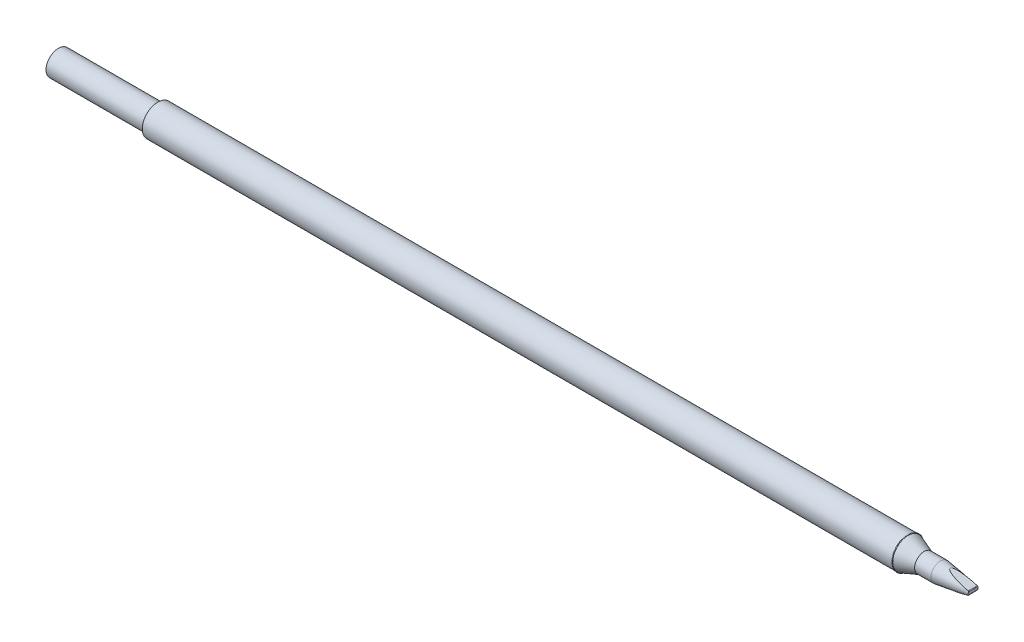
ISO-10303-21;
HEADER;
FILE_DESCRIPTION(('STEP AP214'),'2;1');
FILE_NAME('part.step','',(''),(''),'','','');
FILE_SCHEMA(('AUTOMOTIVE_DESIGN { 1 0 10303 214 1 1 1 1 }'));
ENDSEC;
DATA;
#1=APPLICATION_CONTEXT('core data for automotive mechanical design processes');
#2=APPLICATION_PROTOCOL_DEFINITION('international standard','automotive_design',2000,#1);
#3=PRODUCT_CONTEXT('',#1,'mechanical');
#4=PRODUCT('Part','Part','',(#3));
#5=PRODUCT_RELATED_PRODUCT_CATEGORY('part','',(#4));
#6=PRODUCT_DEFINITION_FORMATION('','',#4);
#7=PRODUCT_DEFINITION_CONTEXT('part definition',#1,'design');
#8=PRODUCT_DEFINITION('design','',#6,#7);
#9=PRODUCT_DEFINITION_SHAPE('','',#8);
#10=(LENGTH_UNIT() NAMED_UNIT(*) SI_UNIT(.MILLI.,.METRE.));
#11=(NAMED_UNIT(*) PLANE_ANGLE_UNIT() SI_UNIT($,.RADIAN.));
#12=(NAMED_UNIT(*) SI_UNIT($,.STERADIAN.) SOLID_ANGLE_UNIT());
#13=UNCERTAINTY_MEASURE_WITH_UNIT(LENGTH_MEASURE(1.E-05),#10,'distance_accuracy_value','');
#14=(GEOMETRIC_REPRESENTATION_CONTEXT(3) GLOBAL_UNCERTAINTY_ASSIGNED_CONTEXT((#13)) GLOBAL_UNIT_ASSIGNED_CONTEXT((#10,
#11,#12)) REPRESENTATION_CONTEXT('',''));
#15=CARTESIAN_POINT('',(0.,0.,0.));
#16=DIRECTION('',(0.,0.,1.));
#17=DIRECTION('',(1.,0.,0.));
#18=AXIS2_PLACEMENT_3D('',#15,#16,#17);
#19=CARTESIAN_POINT('',(0.,0.,0.));
#20=DIRECTION('',(-1.,0.,0.));
#21=DIRECTION('',(0.,0.,1.));
#22=AXIS2_PLACEMENT_3D('',#19,#20,#21);
#23=CYLINDRICAL_SURFACE('',#22,2.365);
#24=CARTESIAN_POINT('',(0.200000000000017,0.,0.));
#25=DIRECTION('',(1.,0.,0.));
#26=DIRECTION('',(0.,0.,-1.));
#27=AXIS2_PLACEMENT_3D('',#24,#25,#26);
#28=CIRCLE('',#27,2.365);
#29=CARTESIAN_POINT('',(0.200000000000017,0.,-2.365));
#30=VERTEX_POINT('',#29);
#31=EDGE_CURVE('E193',#30,#30,#28,.T.);
#32=ORIENTED_EDGE('',*,*,#31,.T.);
#33=EDGE_LOOP('',(#32));
#34=FACE_BOUND('',#33,.T.);
#35=CARTESIAN_POINT('',(114.95,0.,0.));
#36=DIRECTION('',(1.,0.,0.));
#37=DIRECTION('',(0.,0.,-1.));
#38=AXIS2_PLACEMENT_3D('',#35,#36,#37);
#39=CIRCLE('',#38,2.365);
#40=CARTESIAN_POINT('',(114.95,0.,-2.365));
#41=VERTEX_POINT('',#40);
#42=EDGE_CURVE('E192',#41,#41,#39,.T.);
#43=ORIENTED_EDGE('',*,*,#42,.F.);
#44=EDGE_LOOP('',(#43));
#45=FACE_BOUND('',#44,.T.);
#46=ADVANCED_FACE('F36',(#34,#45),#23,.T.);
#47=CARTESIAN_POINT('',(-15.,0.,0.));
#48=DIRECTION('',(1.,0.,0.));
#49=DIRECTION('',(0.,0.,-1.));
#50=AXIS2_PLACEMENT_3D('',#47,#48,#49);
#51=PLANE('',#50);
#52=CARTESIAN_POINT('',(-15.,0.,0.));
#53=DIRECTION('',(1.,0.,0.));
#54=DIRECTION('',(0.,0.,-1.));
#55=AXIS2_PLACEMENT_3D('',#52,#53,#54);
#56=CIRCLE('',#55,0.0499999999999983);
#57=CARTESIAN_POINT('',(-15.,0.,-0.0499999999999983));
#58=VERTEX_POINT('',#57);
#59=EDGE_CURVE('E363',#58,#58,#56,.F.);
#60=ORIENTED_EDGE('',*,*,#59,.T.);
#61=EDGE_LOOP('',(#60));
#62=FACE_BOUND('',#61,.T.);
#63=ADVANCED_FACE('F146',(#62),#51,.F.);
#64=CARTESIAN_POINT('',(0.,0.,0.));
#65=DIRECTION('',(-1.,0.,0.));
#66=DIRECTION('',(0.,0.,1.));
#67=AXIS2_PLACEMENT_3D('',#64,#65,#66);
#68=CYLINDRICAL_SURFACE('',#67,0.499999999999998);
#69=CARTESIAN_POINT('',(-14.55,0.,0.));
#70=DIRECTION('',(1.,0.,0.));
#71=DIRECTION('',(0.,0.,-1.));
#72=AXIS2_PLACEMENT_3D('',#69,#70,#71);
#73=CIRCLE('',#72,0.499999999999998);
#74=CARTESIAN_POINT('',(-14.55,0.,-0.499999999999998));
#75=VERTEX_POINT('',#74);
#76=EDGE_CURVE('E366',#75,#75,#73,.T.);
#77=ORIENTED_EDGE('',*,*,#76,.T.);
#78=EDGE_LOOP('',(#77));
#79=FACE_BOUND('',#78,.T.);
#80=CARTESIAN_POINT('',(0.,0.,0.));
#81=DIRECTION('',(-1.,0.,0.));
#82=DIRECTION('',(0.,0.,1.));
#83=AXIS2_PLACEMENT_3D('',#80,#81,#82);
#84=CIRCLE('',#83,0.499999999999999);
#85=CARTESIAN_POINT('',(0.,0.,0.499999999999999));
#86=VERTEX_POINT('',#85);
#87=EDGE_CURVE('E360',#86,#86,#84,.T.);
#88=ORIENTED_EDGE('',*,*,#87,.T.);
#89=EDGE_LOOP('',(#88));
#90=FACE_BOUND('',#89,.T.);
#91=ADVANCED_FACE('F149',(#79,#90),#68,.T.);
#92=CARTESIAN_POINT('',(0.,0.499999999999999,0.));
#93=DIRECTION('',(1.,0.,0.));
#94=DIRECTION('',(0.,0.,-1.));
#95=AXIS2_PLACEMENT_3D('',#92,#93,#94);
#96=PLANE('',#95);
#97=ORIENTED_EDGE('',*,*,#87,.F.);
#98=EDGE_LOOP('',(#97));
#99=FACE_BOUND('',#98,.T.);
#100=CARTESIAN_POINT('',(0.,0.,0.));
#101=DIRECTION('',(-1.,0.,0.));
#102=DIRECTION('',(0.,0.,1.));
#103=AXIS2_PLACEMENT_3D('',#100,#101,#102);
#104=CIRCLE('',#103,1.49);
#105=CARTESIAN_POINT('',(0.,0.,1.49));
#106=VERTEX_POINT('',#105);
#107=EDGE_CURVE('E357',#106,#106,#104,.T.);
#108=ORIENTED_EDGE('',*,*,#107,.T.);
#109=EDGE_LOOP('',(#108));
#110=FACE_BOUND('',#109,.T.);
#111=ADVANCED_FACE('F153',(#99,#110),#96,.F.);
#112=CARTESIAN_POINT('',(0.,0.,0.));
#113=DIRECTION('',(-1.,0.,0.));
#114=DIRECTION('',(0.,0.,1.));
#115=AXIS2_PLACEMENT_3D('',#112,#113,#114);
#116=CYLINDRICAL_SURFACE('',#115,1.49);
#117=ORIENTED_EDGE('',*,*,#107,.F.);
#118=EDGE_LOOP('',(#117));
#119=FACE_BOUND('',#118,.T.);
#120=CARTESIAN_POINT('',(-15.,0.,0.));
#121=DIRECTION('',(-1.,0.,0.));
#122=DIRECTION('',(0.,0.,1.));
#123=AXIS2_PLACEMENT_3D('',#120,#121,#122);
#124=CIRCLE('',#123,1.49);
#125=CARTESIAN_POINT('',(-15.,0.,1.49));
#126=VERTEX_POINT('',#125);
#127=EDGE_CURVE('E354',#126,#126,#124,.T.);
#128=ORIENTED_EDGE('',*,*,#127,.T.);
#129=EDGE_LOOP('',(#128));
#130=FACE_BOUND('',#129,.T.);
#131=ADVANCED_FACE('F157',(#119,#130),#116,.F.);
#132=CARTESIAN_POINT('',(-15.,1.49,0.));
#133=DIRECTION('',(1.,0.,0.));
#134=DIRECTION('',(0.,0.,-1.));
#135=AXIS2_PLACEMENT_3D('',#132,#133,#134);
#136=PLANE('',#135);
#137=ORIENTED_EDGE('',*,*,#127,.F.);
#138=EDGE_LOOP('',(#137));
#139=FACE_BOUND('',#138,.T.);
#140=CARTESIAN_POINT('',(-15.,0.,0.));
#141=DIRECTION('',(-1.,0.,0.));
#142=DIRECTION('',(0.,0.,1.));
#143=AXIS2_PLACEMENT_3D('',#140,#141,#142);
#144=CIRCLE('',#143,1.9);
#145=CARTESIAN_POINT('',(-15.,0.,1.9));
#146=VERTEX_POINT('',#145);
#147=EDGE_CURVE('E351',#146,#146,#144,.T.);
#148=ORIENTED_EDGE('',*,*,#147,.T.);
#149=EDGE_LOOP('',(#148));
#150=FACE_BOUND('',#149,.T.);
#151=ADVANCED_FACE('F161',(#139,#150),#136,.F.);
#152=CARTESIAN_POINT('',(0.,0.,0.));
#153=DIRECTION('',(-1.,0.,0.));
#154=DIRECTION('',(0.,0.,1.));
#155=AXIS2_PLACEMENT_3D('',#152,#153,#154);
#156=CYLINDRICAL_SURFACE('',#155,1.9);
#157=ORIENTED_EDGE('',*,*,#147,.F.);
#158=EDGE_LOOP('',(#157));
#159=FACE_BOUND('',#158,.T.);
#160=CARTESIAN_POINT('',(0.,0.,0.));
#161=DIRECTION('',(-1.,0.,0.));
#162=DIRECTION('',(0.,0.,1.));
#163=AXIS2_PLACEMENT_3D('',#160,#161,#162);
#164=CIRCLE('',#163,1.9);
#165=CARTESIAN_POINT('',(0.,0.,1.9));
#166=VERTEX_POINT('',#165);
#167=EDGE_CURVE('E348',#166,#166,#164,.T.);
#168=ORIENTED_EDGE('',*,*,#167,.T.);
#169=EDGE_LOOP('',(#168));
#170=FACE_BOUND('',#169,.T.);
#171=ADVANCED_FACE('F165',(#159,#170),#156,.T.);
#172=CARTESIAN_POINT('',(0.,1.9,0.));
#173=DIRECTION('',(1.,0.,0.));
#174=DIRECTION('',(0.,0.,-1.));
#175=AXIS2_PLACEMENT_3D('',#172,#173,#174);
#176=PLANE('',#175);
#177=CARTESIAN_POINT('',(0.,0.,0.));
#178=DIRECTION('',(1.,0.,0.));
#179=DIRECTION('',(0.,0.,-1.));
#180=AXIS2_PLACEMENT_3D('',#177,#178,#179);
#181=CIRCLE('',#180,2.01858983848621);
#182=CARTESIAN_POINT('',(0.,0.,-2.01858983848621));
#183=VERTEX_POINT('',#182);
#184=EDGE_CURVE('E199',#183,#183,#181,.F.);
#185=ORIENTED_EDGE('',*,*,#184,.T.);
#186=EDGE_LOOP('',(#185));
#187=FACE_BOUND('',#186,.T.);
#188=ORIENTED_EDGE('',*,*,#167,.F.);
#189=EDGE_LOOP('',(#188));
#190=FACE_BOUND('',#189,.T.);
#191=ADVANCED_FACE('F142',(#187,#190),#176,.F.);
#192=CARTESIAN_POINT('',(-14.55,0.,0.));
#193=DIRECTION('',(1.,0.,0.));
#194=DIRECTION('',(0.,0.,-1.));
#195=AXIS2_PLACEMENT_3D('',#192,#193,#194);
#196=DEGENERATE_TOROIDAL_SURFACE('',#195,0.0499999999999983,0.45,.T.);
#197=ORIENTED_EDGE('',*,*,#76,.F.);
#198=EDGE_LOOP('',(#197));
#199=FACE_BOUND('',#198,.T.);
#200=ORIENTED_EDGE('',*,*,#59,.F.);
#201=EDGE_LOOP('',(#200));
#202=FACE_BOUND('',#201,.T.);
#203=ADVANCED_FACE('F138',(#199,#202),#196,.T.);
#204=CARTESIAN_POINT('',(0.,0.,0.));
#205=DIRECTION('',(1.,0.,0.));
#206=DIRECTION('',(0.,0.,-1.));
#207=AXIS2_PLACEMENT_3D('',#204,#205,#206);
#208=CONICAL_SURFACE('',#207,2.01858983848621,1.04719755119658);
#209=ORIENTED_EDGE('',*,*,#31,.F.);
#210=EDGE_LOOP('',(#209));
#211=FACE_BOUND('',#210,.T.);
#212=ORIENTED_EDGE('',*,*,#184,.F.);
#213=EDGE_LOOP('',(#212));
#214=FACE_BOUND('',#213,.T.);
#215=ADVANCED_FACE('F134',(#211,#214),#208,.T.);
#216=CARTESIAN_POINT('',(115.,0.,0.));
#217=DIRECTION('',(-1.,0.,0.));
#218=DIRECTION('',(0.,0.,1.));
#219=AXIS2_PLACEMENT_3D('',#216,#217,#218);
#220=TOROIDAL_SURFACE('',#219,2.365,0.0499999999999968);
#221=CARTESIAN_POINT('',(115.046953925083,0.,0.));
#222=DIRECTION('',(-1.,0.,0.));
#223=DIRECTION('',(0.,0.,1.));
#224=AXIS2_PLACEMENT_3D('',#221,#222,#223);
#225=CIRCLE('',#224,2.34781486341955);
#226=CARTESIAN_POINT('',(115.046953925083,0.,2.34781486341955));
#227=VERTEX_POINT('',#226);
#228=EDGE_CURVE('E190',#227,#227,#225,.T.);
#229=ORIENTED_EDGE('',*,*,#228,.T.);
#230=EDGE_LOOP('',(#229));
#231=FACE_BOUND('',#230,.T.);
#232=ORIENTED_EDGE('',*,*,#42,.T.);
#233=EDGE_LOOP('',(#232));
#234=FACE_BOUND('',#233,.T.);
#235=ADVANCED_FACE('F117',(#231,#234),#220,.T.);
#236=CARTESIAN_POINT('',(125.,0.75,0.));
#237=DIRECTION('',(-1.,0.,0.));
#238=DIRECTION('',(0.,0.,1.));
#239=AXIS2_PLACEMENT_3D('',#236,#237,#238);
#240=PLANE('',#239);
#241=CARTESIAN_POINT('',(125.,0.,0.));
#242=DIRECTION('',(-1.,0.,0.));
#243=DIRECTION('',(0.,0.,1.));
#244=AXIS2_PLACEMENT_3D('',#241,#242,#243);
#245=CIRCLE('',#244,0.75);
#246=CARTESIAN_POINT('',(125.,-0.198787657436542,0.72317595870638));
#247=VERTEX_POINT('',#246);
#248=CARTESIAN_POINT('',(125.,0.198787657436542,0.72317595870638));
#249=VERTEX_POINT('',#248);
#250=EDGE_CURVE('E79',#247,#249,#245,.T.);
#251=ORIENTED_EDGE('',*,*,#250,.F.);
#252=DIRECTION('',(0.,0.,-1.));
#253=VECTOR('',#252,1.);
#254=CARTESIAN_POINT('',(125.,-0.198787657436542,0.));
#255=LINE('',#254,#253);
#256=CARTESIAN_POINT('',(125.,-0.198787657436542,-0.72317595870638));
#257=VERTEX_POINT('',#256);
#258=EDGE_CURVE('E92',#247,#257,#255,.T.);
#259=ORIENTED_EDGE('',*,*,#258,.T.);
#260=CARTESIAN_POINT('',(125.,0.198787657436542,-0.72317595870638));
#261=VERTEX_POINT('',#260);
#262=EDGE_CURVE('E95',#261,#257,#245,.T.);
#263=ORIENTED_EDGE('',*,*,#262,.F.);
#264=DIRECTION('',(0.,0.,1.));
#265=VECTOR('',#264,1.);
#266=CARTESIAN_POINT('',(125.,0.198787657436542,0.));
#267=LINE('',#266,#265);
#268=EDGE_CURVE('E94',#261,#249,#267,.T.);
#269=ORIENTED_EDGE('',*,*,#268,.T.);
#270=EDGE_LOOP('',(#251,#259,#263,#269));
#271=FACE_BOUND('',#270,.T.);
#272=ADVANCED_FACE('F90',(#271),#240,.F.);
#273=CARTESIAN_POINT('',(125.,0.,0.));
#274=DIRECTION('',(-1.,0.,0.));
#275=DIRECTION('',(0.,0.,1.));
#276=AXIS2_PLACEMENT_3D('',#273,#274,#275);
#277=CONICAL_SURFACE('',#276,0.75,0.139095941482072);
#278=CARTESIAN_POINT('',(120.,0.,0.));
#279=DIRECTION('',(-1.,0.,0.));
#280=DIRECTION('',(0.,0.,1.));
#281=AXIS2_PLACEMENT_3D('',#278,#279,#280);
#282=CIRCLE('',#281,1.45);
#283=CARTESIAN_POINT('',(120.,0.,1.45));
#284=VERTEX_POINT('',#283);
#285=EDGE_CURVE('E343',#284,#284,#282,.T.);
#286=ORIENTED_EDGE('',*,*,#285,.F.);
#287=EDGE_LOOP('',(#286));
#288=FACE_BOUND('',#287,.T.);
#289=ORIENTED_EDGE('',*,*,#262,.T.);
#290=CARTESIAN_POINT('',(125.,-0.198787657436542,-0.72317595870638));
#291=CARTESIAN_POINT('',(125.000003507059,-0.204553288456461,-0.721593490091671));
#292=CARTESIAN_POINT('',(124.999501541528,-0.210317406382677,-0.720004951516099));
#293=CARTESIAN_POINT('',(124.997511568684,-0.221693849510812,-0.716873937111745));
#294=CARTESIAN_POINT('',(124.996022300598,-0.227305971065097,-0.715331522818555));
#295=CARTESIAN_POINT('',(124.992081167227,-0.238218482839555,-0.712354122134174));
#296=CARTESIAN_POINT('',(124.989628529648,-0.243518619024399,-0.710919223035155));
#297=CARTESIAN_POINT('',(124.983814287478,-0.253643789631828,-0.708234531805531));
#298=CARTESIAN_POINT('',(124.980453260358,-0.258469123241613,-0.706984622853527));
#299=CARTESIAN_POINT('',(124.973000197767,-0.267371775752997,-0.704781424492752));
#300=CARTESIAN_POINT('',(124.968929919946,-0.27146554233544,-0.703821145917506));
#301=CARTESIAN_POINT('',(124.960107365752,-0.278914808504914,-0.702231666127871));
#302=CARTESIAN_POINT('',(124.955355697587,-0.28227095979031,-0.701602171968961));
#303=CARTESIAN_POINT('',(124.946613628536,-0.287363917743545,-0.700852048190955));
#304=CARTESIAN_POINT('',(124.942742724045,-0.289295142025169,-0.700642075326405));
#305=CARTESIAN_POINT('',(124.934777984086,-0.292645407978159,-0.700457680044558));
#306=CARTESIAN_POINT('',(124.930684040212,-0.29406419798062,-0.700483373205506));
#307=CARTESIAN_POINT('',(124.926515648302,-0.29520819671692,-0.700635192854751));
#308=B_SPLINE_CURVE_WITH_KNOTS('',3,(#290,#291,#292,#293,#294,#295,#296,#297,#298,#299,#300,
#301,#302,#303,#304,#305,#306,#307),.UNSPECIFIED.,.F.,.F.,(4,2,2,2,2,2,2,2,4),(0.,
0.017916106136919,0.0358551351021427,0.0538085744948017,0.0717506274548506,0.0892167099226524,
0.106667298150119,0.119619628639407,0.132578311710199),.UNSPECIFIED.);
#309=CARTESIAN_POINT('',(124.926515648302,-0.295208196716921,-0.700635192854749));
#310=VERTEX_POINT('',#309);
#311=EDGE_CURVE('E85',#257,#310,#308,.T.);
#312=ORIENTED_EDGE('',*,*,#311,.T.);
#313=CARTESIAN_POINT('',(124.475680499777,-0.419187862561356,0.));
#314=DIRECTION('',(-0.265156483021043,0.96420539280379,0.));
#315=DIRECTION('',(-0.96420539280379,-0.265156483021043,0.));
#316=AXIS2_PLACEMENT_3D('',#313,#314,#315);
#317=ELLIPSE('',#316,3.1053539428862,0.708714953503207);
#318=CARTESIAN_POINT('',(124.926515648302,-0.295208196716921,0.700635192854749));
#319=VERTEX_POINT('',#318);
#320=EDGE_CURVE('E81',#310,#319,#317,.T.);
#321=ORIENTED_EDGE('',*,*,#320,.T.);
#322=CARTESIAN_POINT('',(124.926515648302,-0.295208196716921,0.700635192854749));
#323=CARTESIAN_POINT('',(124.931626997485,-0.293808811606557,0.700447162841778));
#324=CARTESIAN_POINT('',(124.936625566287,-0.291991480762701,0.700451516400457));
#325=CARTESIAN_POINT('',(124.946250840768,-0.287604446399892,0.700808396540888));
#326=CARTESIAN_POINT('',(124.950878577893,-0.285036929102975,0.701159918378641));
#327=CARTESIAN_POINT('',(124.959644851769,-0.279225432077028,0.702173636469321));
#328=CARTESIAN_POINT('',(124.963783616915,-0.275981770144516,0.702835686951966));
#329=CARTESIAN_POINT('',(124.971478316973,-0.268917029758876,0.704416042498972));
#330=CARTESIAN_POINT('',(124.975034058849,-0.265095760866702,0.705334432164122));
#331=CARTESIAN_POINT('',(124.981602512672,-0.256837979967937,0.707405700552667));
#332=CARTESIAN_POINT('',(124.984591612905,-0.252384506312438,0.708565714903353));
#333=CARTESIAN_POINT('',(124.989810394428,-0.243088407630517,0.711036550399219));
#334=CARTESIAN_POINT('',(124.992039488613,-0.238245485307717,0.712347487091013));
#335=CARTESIAN_POINT('',(124.995896989285,-0.227741863148172,0.715211817420555));
#336=CARTESIAN_POINT('',(124.997432332888,-0.22204981059565,0.716776018348112));
#337=CARTESIAN_POINT('',(124.999485674036,-0.210501187506141,0.719954386539173));
#338=CARTESIAN_POINT('',(125.000004092818,-0.204644686108111,0.721568532832488));
#339=CARTESIAN_POINT('',(125.,-0.198787657436544,0.72317595870638));
#340=B_SPLINE_CURVE_WITH_KNOTS('',3,(#322,#323,#324,#325,#326,#327,#328,#329,#330,#331,#332,
#333,#334,#335,#336,#337,#338,#339),.UNSPECIFIED.,.F.,.F.,(4,2,2,2,2,2,2,2,4),(0.,
0.0158806546856654,0.0317154832569595,0.0475428859728207,0.0633755184675213,0.0797672817936434,
0.0961716792244259,0.114380788868078,0.132582354246609),.UNSPECIFIED.);
#341=EDGE_CURVE('E75',#319,#247,#340,.T.);
#342=ORIENTED_EDGE('',*,*,#341,.T.);
#343=ORIENTED_EDGE('',*,*,#250,.T.);
#344=CARTESIAN_POINT('',(125.,0.198787657436542,0.72317595870638));
#345=CARTESIAN_POINT('',(125.000003507059,0.204553288456461,0.721593490091671));
#346=CARTESIAN_POINT('',(124.999501541528,0.210317406382677,0.720004951516099));
#347=CARTESIAN_POINT('',(124.997511568684,0.221693849510812,0.716873937111745));
#348=CARTESIAN_POINT('',(124.996022300598,0.227305971065097,0.715331522818555));
#349=CARTESIAN_POINT('',(124.992081167227,0.238218482839555,0.712354122134174));
#350=CARTESIAN_POINT('',(124.989628529648,0.243518619024399,0.710919223035155));
#351=CARTESIAN_POINT('',(124.983814287478,0.253643789631828,0.708234531805531));
#352=CARTESIAN_POINT('',(124.980453260358,0.258469123241613,0.706984622853527));
#353=CARTESIAN_POINT('',(124.973000197767,0.267371775752997,0.704781424492752));
#354=CARTESIAN_POINT('',(124.968929919946,0.27146554233544,0.703821145917506));
#355=CARTESIAN_POINT('',(124.960107365752,0.278914808504914,0.702231666127871));
#356=CARTESIAN_POINT('',(124.955355697587,0.28227095979031,0.701602171968961));
#357=CARTESIAN_POINT('',(124.946613628536,0.287363917743545,0.700852048190955));
#358=CARTESIAN_POINT('',(124.942742724045,0.289295142025169,0.700642075326405));
#359=CARTESIAN_POINT('',(124.934777984086,0.292645407978159,0.700457680044558));
#360=CARTESIAN_POINT('',(124.930684040212,0.29406419798062,0.700483373205506));
#361=CARTESIAN_POINT('',(124.926515648302,0.295208196716921,0.700635192854751));
#362=B_SPLINE_CURVE_WITH_KNOTS('',3,(#344,#345,#346,#347,#348,#349,#350,#351,#352,#353,#354,
#355,#356,#357,#358,#359,#360,#361),.UNSPECIFIED.,.F.,.F.,(4,2,2,2,2,2,2,2,4),(0.,
0.017916106136919,0.0358551351021426,0.0538085744948016,0.0717506274548505,0.0892167099226523,
0.106667298150119,0.119619628639407,0.132578311710199),.UNSPECIFIED.);
#363=CARTESIAN_POINT('',(124.926515648302,0.295208196716921,0.700635192854749));
#364=VERTEX_POINT('',#363);
#365=EDGE_CURVE('E56',#249,#364,#362,.T.);
#366=ORIENTED_EDGE('',*,*,#365,.T.);
#367=CARTESIAN_POINT('',(124.475680499777,0.419187862561356,0.));
#368=DIRECTION('',(-0.265156483021043,-0.96420539280379,0.));
#369=DIRECTION('',(-0.96420539280379,0.265156483021043,0.));
#370=AXIS2_PLACEMENT_3D('',#367,#368,#369);
#371=ELLIPSE('',#370,3.1053539428862,0.708714953503207);
#372=CARTESIAN_POINT('',(124.926515648302,0.295208196716921,-0.700635192854749));
#373=VERTEX_POINT('',#372);
#374=EDGE_CURVE('E196',#364,#373,#371,.T.);
#375=ORIENTED_EDGE('',*,*,#374,.T.);
#376=CARTESIAN_POINT('',(124.926515648302,0.295208196716921,-0.700635192854749));
#377=CARTESIAN_POINT('',(124.931626997485,0.293808811606557,-0.700447162841778));
#378=CARTESIAN_POINT('',(124.936625566287,0.291991480762701,-0.700451516400457));
#379=CARTESIAN_POINT('',(124.946250840768,0.287604446399892,-0.700808396540888));
#380=CARTESIAN_POINT('',(124.950878577893,0.285036929102975,-0.701159918378641));
#381=CARTESIAN_POINT('',(124.959644851769,0.279225432077028,-0.702173636469321));
#382=CARTESIAN_POINT('',(124.963783616915,0.275981770144516,-0.702835686951966));
#383=CARTESIAN_POINT('',(124.971478316973,0.268917029758876,-0.704416042498972));
#384=CARTESIAN_POINT('',(124.975034058849,0.265095760866702,-0.705334432164122));
#385=CARTESIAN_POINT('',(124.981602512672,0.256837979967938,-0.707405700552667));
#386=CARTESIAN_POINT('',(124.984591612905,0.252384506312438,-0.708565714903353));
#387=CARTESIAN_POINT('',(124.989810394428,0.243088407630517,-0.711036550399219));
#388=CARTESIAN_POINT('',(124.992039488613,0.238245485307717,-0.712347487091013));
#389=CARTESIAN_POINT('',(124.995896989285,0.227741863148172,-0.715211817420555));
#390=CARTESIAN_POINT('',(124.997432332888,0.22204981059565,-0.716776018348112));
#391=CARTESIAN_POINT('',(124.999485674036,0.210501187506141,-0.719954386539173));
#392=CARTESIAN_POINT('',(125.000004092818,0.204644686108112,-0.721568532832488));
#393=CARTESIAN_POINT('',(125.,0.198787657436545,-0.72317595870638));
#394=B_SPLINE_CURVE_WITH_KNOTS('',3,(#376,#377,#378,#379,#380,#381,#382,#383,#384,#385,#386,
#387,#388,#389,#390,#391,#392,#393),.UNSPECIFIED.,.F.,.F.,(4,2,2,2,2,2,2,2,4),(0.,
0.0158806546856654,0.0317154832569595,0.0475428859728207,0.0633755184675213,0.0797672817936435,
0.0961716792244259,0.114380788868078,0.132582354246608),.UNSPECIFIED.);
#395=EDGE_CURVE('E98',#373,#261,#394,.T.);
#396=ORIENTED_EDGE('',*,*,#395,.T.);
#397=EDGE_LOOP('',(#289,#312,#321,#342,#343,#366,#375,#396));
#398=FACE_BOUND('',#397,.T.);
#399=ADVANCED_FACE('F78',(#288,#398),#277,.T.);
#400=CARTESIAN_POINT('',(0.,0.,0.));
#401=DIRECTION('',(-1.,0.,0.));
#402=DIRECTION('',(0.,0.,1.));
#403=AXIS2_PLACEMENT_3D('',#400,#401,#402);
#404=CYLINDRICAL_SURFACE('',#403,1.45);
#405=CARTESIAN_POINT('',(117.5,0.,0.));
#406=DIRECTION('',(-1.,0.,0.));
#407=DIRECTION('',(0.,0.,1.));
#408=AXIS2_PLACEMENT_3D('',#405,#406,#407);
#409=CIRCLE('',#408,1.45);
#410=CARTESIAN_POINT('',(117.5,0.,1.45));
#411=VERTEX_POINT('',#410);
#412=EDGE_CURVE('E187',#411,#411,#409,.T.);
#413=ORIENTED_EDGE('',*,*,#412,.F.);
#414=EDGE_LOOP('',(#413));
#415=FACE_BOUND('',#414,.T.);
#416=ORIENTED_EDGE('',*,*,#285,.T.);
#417=EDGE_LOOP('',(#416));
#418=FACE_BOUND('',#417,.T.);
#419=ADVANCED_FACE('F115',(#415,#418),#404,.T.);
#420=CARTESIAN_POINT('',(117.5,0.,0.));
#421=DIRECTION('',(-1.,0.,0.));
#422=DIRECTION('',(0.,0.,1.));
#423=AXIS2_PLACEMENT_3D('',#420,#421,#422);
#424=CONICAL_SURFACE('',#423,1.45,0.350857008260393);
#425=ORIENTED_EDGE('',*,*,#412,.T.);
#426=EDGE_LOOP('',(#425));
#427=FACE_BOUND('',#426,.T.);
#428=ORIENTED_EDGE('',*,*,#228,.F.);
#429=EDGE_LOOP('',(#428));
#430=FACE_BOUND('',#429,.T.);
#431=ADVANCED_FACE('F175',(#427,#430),#424,.T.);
#432=CARTESIAN_POINT('',(120.,1.65,-5.));
#433=DIRECTION('',(-0.265156483021043,-0.96420539280379,0.));
#434=DIRECTION('',(0.96420539280379,-0.265156483021043,0.));
#435=AXIS2_PLACEMENT_3D('',#432,#433,#434);
#436=PLANE('',#435);
#437=ORIENTED_EDGE('',*,*,#374,.F.);
#438=DIRECTION('',(0.,0.,1.));
#439=VECTOR('',#438,1.);
#440=CARTESIAN_POINT('',(124.926515648302,0.295208196716921,-5.));
#441=LINE('',#440,#439);
#442=EDGE_CURVE('E11',#364,#373,#441,.F.);
#443=ORIENTED_EDGE('',*,*,#442,.T.);
#444=EDGE_LOOP('',(#437,#443));
#445=FACE_BOUND('',#444,.T.);
#446=ADVANCED_FACE('F177',(#445),#436,.F.);
#447=CARTESIAN_POINT('',(120.,-1.65,-5.));
#448=DIRECTION('',(-0.265156483021043,0.96420539280379,0.));
#449=DIRECTION('',(-0.96420539280379,-0.265156483021043,0.));
#450=AXIS2_PLACEMENT_3D('',#447,#448,#449);
#451=PLANE('',#450);
#452=ORIENTED_EDGE('',*,*,#320,.F.);
#453=DIRECTION('',(0.,0.,-1.));
#454=VECTOR('',#453,1.);
#455=CARTESIAN_POINT('',(124.926515648302,-0.295208196716921,-5.));
#456=LINE('',#455,#454);
#457=EDGE_CURVE('E45',#310,#319,#456,.F.);
#458=ORIENTED_EDGE('',*,*,#457,.T.);
#459=EDGE_LOOP('',(#452,#458));
#460=FACE_BOUND('',#459,.T.);
#461=ADVANCED_FACE('F133',(#460),#451,.F.);
#462=CARTESIAN_POINT('',(124.9,-0.198787657436542,0.));
#463=DIRECTION('',(0.,0.,-1.));
#464=DIRECTION('',(-1.,0.,0.));
#465=AXIS2_PLACEMENT_3D('',#462,#463,#464);
#466=CYLINDRICAL_SURFACE('',#465,0.1);
#467=ORIENTED_EDGE('',*,*,#341,.F.);
#468=ORIENTED_EDGE('',*,*,#457,.F.);
#469=ORIENTED_EDGE('',*,*,#311,.F.);
#470=ORIENTED_EDGE('',*,*,#258,.F.);
#471=EDGE_LOOP('',(#467,#468,#469,#470));
#472=FACE_BOUND('',#471,.T.);
#473=ADVANCED_FACE('F97',(#472),#466,.T.);
#474=CARTESIAN_POINT('',(124.9,0.198787657436542,0.));
#475=DIRECTION('',(0.,0.,1.));
#476=DIRECTION('',(1.,0.,0.));
#477=AXIS2_PLACEMENT_3D('',#474,#475,#476);
#478=CYLINDRICAL_SURFACE('',#477,0.1);
#479=ORIENTED_EDGE('',*,*,#395,.F.);
#480=ORIENTED_EDGE('',*,*,#442,.F.);
#481=ORIENTED_EDGE('',*,*,#365,.F.);
#482=ORIENTED_EDGE('',*,*,#268,.F.);
#483=EDGE_LOOP('',(#479,#480,#481,#482));
#484=FACE_BOUND('',#483,.T.);
#485=ADVANCED_FACE('F38',(#484),#478,.T.);
#486=CLOSED_SHELL('',(#46,#63,#91,#111,#131,#151,#171,#191,#203,#215,#235,#272,#399,#419,#431,
#446,#461,#473,#485));
#487=MANIFOLD_SOLID_BREP('B2',#486);
#488=ADVANCED_BREP_SHAPE_REPRESENTATION('',(#18,#487),#14);
#489=SHAPE_DEFINITION_REPRESENTATION(#9,#488);
ENDSEC;
END-ISO-10303-21;
